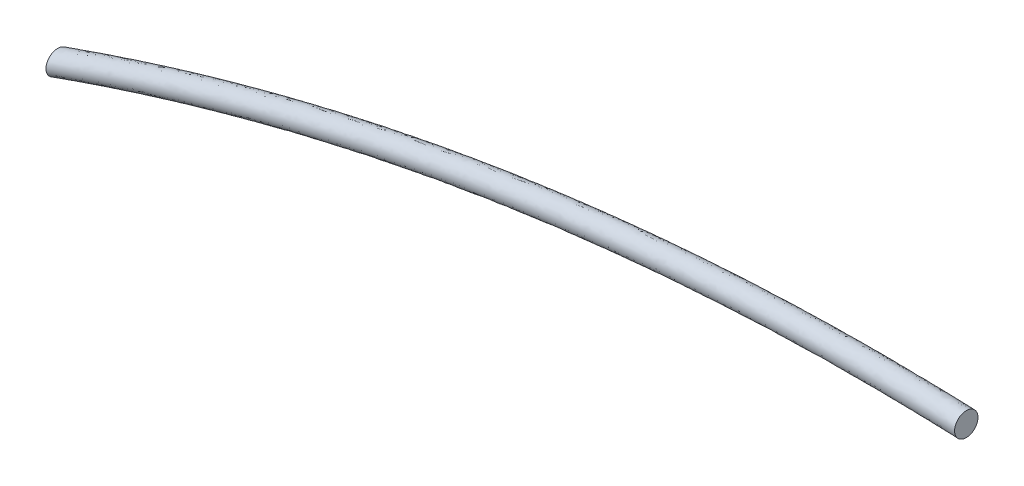
ISO-10303-21;
HEADER;
FILE_DESCRIPTION(('STEP AP214'),'2;1');
FILE_NAME('part.step','',(''),(''),'','','');
FILE_SCHEMA(('AUTOMOTIVE_DESIGN { 1 0 10303 214 1 1 1 1 }'));
ENDSEC;
DATA;
#1=APPLICATION_CONTEXT('core data for automotive mechanical design processes');
#2=APPLICATION_PROTOCOL_DEFINITION('international standard','automotive_design',2000,#1);
#3=PRODUCT_CONTEXT('',#1,'mechanical');
#4=PRODUCT('Part','Part','',(#3));
#5=PRODUCT_RELATED_PRODUCT_CATEGORY('part','',(#4));
#6=PRODUCT_DEFINITION_FORMATION('','',#4);
#7=PRODUCT_DEFINITION_CONTEXT('part definition',#1,'design');
#8=PRODUCT_DEFINITION('design','',#6,#7);
#9=PRODUCT_DEFINITION_SHAPE('','',#8);
#10=(LENGTH_UNIT() NAMED_UNIT(*) SI_UNIT(.MILLI.,.METRE.));
#11=(NAMED_UNIT(*) PLANE_ANGLE_UNIT() SI_UNIT($,.RADIAN.));
#12=(NAMED_UNIT(*) SI_UNIT($,.STERADIAN.) SOLID_ANGLE_UNIT());
#13=UNCERTAINTY_MEASURE_WITH_UNIT(LENGTH_MEASURE(1.E-05),#10,'distance_accuracy_value','');
#14=(GEOMETRIC_REPRESENTATION_CONTEXT(3) GLOBAL_UNCERTAINTY_ASSIGNED_CONTEXT((#13)) GLOBAL_UNIT_ASSIGNED_CONTEXT((#10,
#11,#12)) REPRESENTATION_CONTEXT('',''));
#15=CARTESIAN_POINT('',(0.,0.,0.));
#16=DIRECTION('',(0.,0.,1.));
#17=DIRECTION('',(1.,0.,0.));
#18=AXIS2_PLACEMENT_3D('',#15,#16,#17);
#19=CARTESIAN_POINT('',(198.,53.,0.));
#20=DIRECTION('',(1.,0.,0.));
#21=DIRECTION('',(0.,0.,-1.));
#22=AXIS2_PLACEMENT_3D('',#19,#20,#21);
#23=PLANE('',#22);
#24=CARTESIAN_POINT('',(198.,53.,0.));
#25=DIRECTION('',(1.,0.,0.));
#26=DIRECTION('',(0.,0.,-1.));
#27=AXIS2_PLACEMENT_3D('',#24,#25,#26);
#28=CIRCLE('',#27,2.5);
#29=CARTESIAN_POINT('',(198.,53.,-2.5));
#30=VERTEX_POINT('',#29);
#31=EDGE_CURVE('E39',#30,#30,#28,.T.);
#32=ORIENTED_EDGE('',*,*,#31,.T.);
#33=EDGE_LOOP('',(#32));
#34=FACE_BOUND('',#33,.T.);
#35=ADVANCED_FACE('F32',(#34),#23,.T.);
#36=CARTESIAN_POINT('',(4.,22.9784892037643,0.));
#37=DIRECTION('',(1.,0.,0.));
#38=DIRECTION('',(0.,0.,-1.));
#39=AXIS2_PLACEMENT_3D('',#36,#37,#38);
#40=PLANE('',#39);
#41=CARTESIAN_POINT('',(4.,22.9784892037643,0.));
#42=DIRECTION('',(1.,0.,0.));
#43=DIRECTION('',(0.,0.,-1.));
#44=AXIS2_PLACEMENT_3D('',#41,#42,#43);
#45=CIRCLE('',#44,2.5);
#46=CARTESIAN_POINT('',(4.,22.9784892037643,-2.5));
#47=VERTEX_POINT('',#46);
#48=EDGE_CURVE('E11',#47,#47,#45,.T.);
#49=ORIENTED_EDGE('',*,*,#48,.F.);
#50=EDGE_LOOP('',(#49));
#51=FACE_BOUND('',#50,.T.);
#52=ADVANCED_FACE('F48',(#51),#40,.F.);
#53=CARTESIAN_POINT('',(198.,53.,-2.5));
#54=CARTESIAN_POINT('',(132.105858312229,55.6274440177669,-2.5));
#55=CARTESIAN_POINT('',(67.439191646031,45.6202737539583,-2.5));
#56=CARTESIAN_POINT('',(4.,22.9784892037643,-2.5));
#57=CARTESIAN_POINT('',(198.,58.,-2.5));
#58=CARTESIAN_POINT('',(132.105858312229,60.6274440177669,-2.5));
#59=CARTESIAN_POINT('',(67.4391916460311,50.6202737539583,-2.5));
#60=CARTESIAN_POINT('',(4.00000000000003,27.9784892037643,-2.5));
#61=CARTESIAN_POINT('',(198.,58.,2.5));
#62=CARTESIAN_POINT('',(132.105858312229,60.6274440177669,2.5));
#63=CARTESIAN_POINT('',(67.4391916460311,50.6202737539583,2.5));
#64=CARTESIAN_POINT('',(4.00000000000003,27.9784892037643,2.5));
#65=CARTESIAN_POINT('',(198.,53.,2.5));
#66=CARTESIAN_POINT('',(132.105858312229,55.6274440177669,2.5));
#67=CARTESIAN_POINT('',(67.439191646031,45.6202737539583,2.5));
#68=CARTESIAN_POINT('',(4.,22.9784892037643,2.5));
#69=CARTESIAN_POINT('',(198.,48.,2.5));
#70=CARTESIAN_POINT('',(132.105858312229,50.6274440177669,2.5));
#71=CARTESIAN_POINT('',(67.4391916460311,40.6202737539583,2.5));
#72=CARTESIAN_POINT('',(4.00000000000003,17.9784892037643,2.5));
#73=CARTESIAN_POINT('',(198.,48.,-2.5));
#74=CARTESIAN_POINT('',(132.105858312229,50.6274440177669,-2.5));
#75=CARTESIAN_POINT('',(67.4391916460311,40.6202737539583,-2.5));
#76=CARTESIAN_POINT('',(4.00000000000003,17.9784892037643,-2.5));
#77=CARTESIAN_POINT('',(198.,53.,-2.5));
#78=CARTESIAN_POINT('',(132.105858312229,55.6274440177669,-2.5));
#79=CARTESIAN_POINT('',(67.439191646031,45.6202737539583,-2.5));
#80=CARTESIAN_POINT('',(4.,22.9784892037643,-2.5));
#81=(BOUNDED_SURFACE() B_SPLINE_SURFACE(3,3,((#53,#54,#55,#56),(#57,#58,#59,#60),(#61,#62,#63,
#64),(#65,#66,#67,#68),(#69,#70,#71,#72),(#73,#74,#75,#76),(#77,#78,#79,#80)),.UNSPECIFIED.,.T.,
.F.,.F.) B_SPLINE_SURFACE_WITH_KNOTS((4,3,4),(4,4),(0.,0.5,1.),(0.,1.),
.UNSPECIFIED.) GEOMETRIC_REPRESENTATION_ITEM() RATIONAL_B_SPLINE_SURFACE(((1.,1.,1.,1.),
(0.333333333333333,0.333333333333333,0.333333333333333,0.333333333333333),(0.333333333333333,
0.333333333333333,0.333333333333333,0.333333333333333),(1.,1.,1.,1.),(0.333333333333333,
0.333333333333333,0.333333333333333,0.333333333333333),(0.333333333333333,0.333333333333333,
0.333333333333333,0.333333333333333),(1.,1.,1.,1.))) REPRESENTATION_ITEM('') SURFACE());
#82=ORIENTED_EDGE('',*,*,#48,.T.);
#83=EDGE_LOOP('',(#82));
#84=FACE_BOUND('',#83,.T.);
#85=ORIENTED_EDGE('',*,*,#31,.F.);
#86=EDGE_LOOP('',(#85));
#87=FACE_BOUND('',#86,.T.);
#88=ADVANCED_FACE('F46',(#84,#87),#81,.F.);
#89=CLOSED_SHELL('',(#35,#52,#88));
#90=MANIFOLD_SOLID_BREP('B2',#89);
#91=ADVANCED_BREP_SHAPE_REPRESENTATION('',(#18,#90),#14);
#92=SHAPE_DEFINITION_REPRESENTATION(#9,#91);
ENDSEC;
END-ISO-10303-21;
